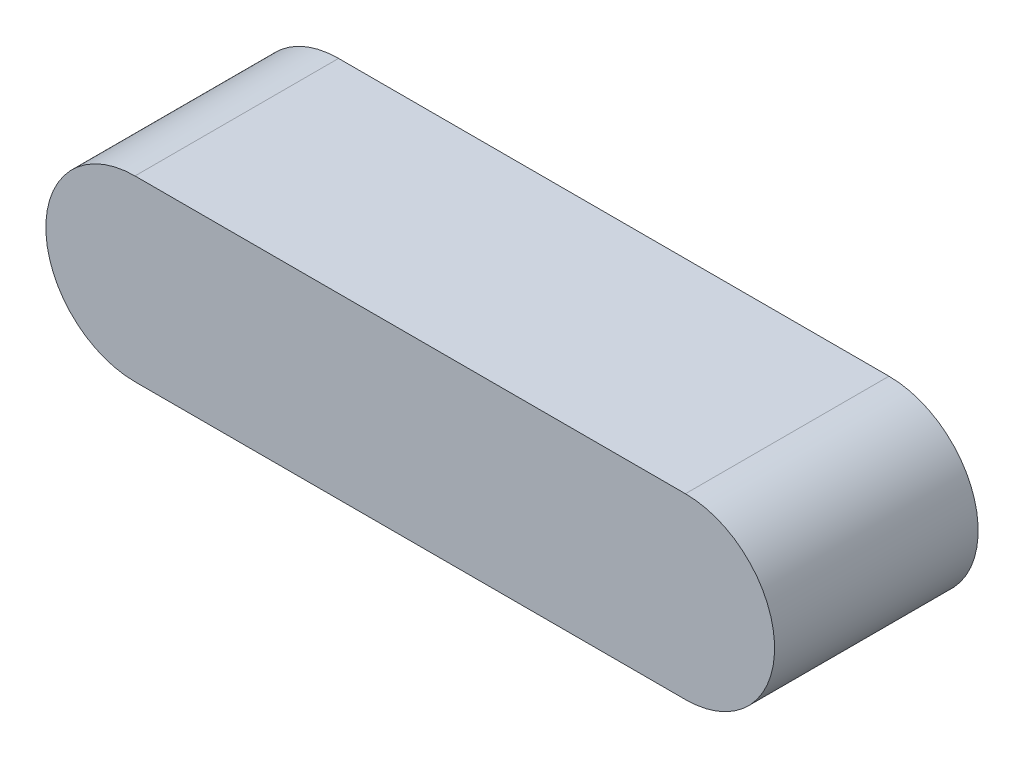
ISO-10303-21;
HEADER;
FILE_DESCRIPTION(('STEP AP214'),'2;1');
FILE_NAME('part.step','',(''),(''),'','','');
FILE_SCHEMA(('AUTOMOTIVE_DESIGN { 1 0 10303 214 1 1 1 1 }'));
ENDSEC;
DATA;
#1=APPLICATION_CONTEXT('core data for automotive mechanical design processes');
#2=APPLICATION_PROTOCOL_DEFINITION('international standard','automotive_design',2000,#1);
#3=PRODUCT_CONTEXT('',#1,'mechanical');
#4=PRODUCT('Part','Part','',(#3));
#5=PRODUCT_RELATED_PRODUCT_CATEGORY('part','',(#4));
#6=PRODUCT_DEFINITION_FORMATION('','',#4);
#7=PRODUCT_DEFINITION_CONTEXT('part definition',#1,'design');
#8=PRODUCT_DEFINITION('design','',#6,#7);
#9=PRODUCT_DEFINITION_SHAPE('','',#8);
#10=(LENGTH_UNIT() NAMED_UNIT(*) SI_UNIT(.MILLI.,.METRE.));
#11=(NAMED_UNIT(*) PLANE_ANGLE_UNIT() SI_UNIT($,.RADIAN.));
#12=(NAMED_UNIT(*) SI_UNIT($,.STERADIAN.) SOLID_ANGLE_UNIT());
#13=UNCERTAINTY_MEASURE_WITH_UNIT(LENGTH_MEASURE(1.E-05),#10,'distance_accuracy_value','');
#14=(GEOMETRIC_REPRESENTATION_CONTEXT(3) GLOBAL_UNCERTAINTY_ASSIGNED_CONTEXT((#13)) GLOBAL_UNIT_ASSIGNED_CONTEXT((#10,
#11,#12)) REPRESENTATION_CONTEXT('',''));
#15=CARTESIAN_POINT('',(0.,0.,0.));
#16=DIRECTION('',(0.,0.,1.));
#17=DIRECTION('',(1.,0.,0.));
#18=AXIS2_PLACEMENT_3D('',#15,#16,#17);
#19=CARTESIAN_POINT('',(-8.6665,-13.719,11.731));
#20=DIRECTION('',(0.,0.,-1.));
#21=DIRECTION('',(-1.,0.,0.));
#22=AXIS2_PLACEMENT_3D('',#19,#20,#21);
#23=CYLINDRICAL_SURFACE('',#22,5.137);
#24=CARTESIAN_POINT('',(-8.6665,-13.719,0.));
#25=DIRECTION('',(0.,0.,1.));
#26=DIRECTION('',(1.,0.,0.));
#27=AXIS2_PLACEMENT_3D('',#24,#25,#26);
#28=CIRCLE('',#27,5.137);
#29=CARTESIAN_POINT('',(-8.6665,-8.582,0.));
#30=VERTEX_POINT('',#29);
#31=CARTESIAN_POINT('',(-8.6665,-18.856,0.));
#32=VERTEX_POINT('',#31);
#33=EDGE_CURVE('E101',#30,#32,#28,.T.);
#34=ORIENTED_EDGE('',*,*,#33,.T.);
#35=DIRECTION('',(0.,0.,-1.));
#36=VECTOR('',#35,1.);
#37=CARTESIAN_POINT('',(-8.6665,-18.856,11.731));
#38=LINE('',#37,#36);
#39=CARTESIAN_POINT('',(-8.6665,-18.856,11.731));
#40=VERTEX_POINT('',#39);
#41=EDGE_CURVE('E11',#40,#32,#38,.T.);
#42=ORIENTED_EDGE('',*,*,#41,.F.);
#43=CARTESIAN_POINT('',(-8.6665,-13.719,11.731));
#44=DIRECTION('',(0.,0.,1.));
#45=DIRECTION('',(1.,0.,0.));
#46=AXIS2_PLACEMENT_3D('',#43,#44,#45);
#47=CIRCLE('',#46,5.137);
#48=CARTESIAN_POINT('',(-8.6665,-8.582,11.731));
#49=VERTEX_POINT('',#48);
#50=EDGE_CURVE('E95',#49,#40,#47,.T.);
#51=ORIENTED_EDGE('',*,*,#50,.F.);
#52=DIRECTION('',(0.,0.,-1.));
#53=VECTOR('',#52,1.);
#54=CARTESIAN_POINT('',(-8.6665,-8.582,11.731));
#55=LINE('',#54,#53);
#56=EDGE_CURVE('E99',#49,#30,#55,.T.);
#57=ORIENTED_EDGE('',*,*,#56,.T.);
#58=EDGE_LOOP('',(#34,#42,#51,#57));
#59=FACE_BOUND('',#58,.T.);
#60=ADVANCED_FACE('F41',(#59),#23,.T.);
#61=CARTESIAN_POINT('',(-8.6665,-18.856,11.731));
#62=DIRECTION('',(0.,1.,0.));
#63=DIRECTION('',(0.,0.,1.));
#64=AXIS2_PLACEMENT_3D('',#61,#62,#63);
#65=PLANE('',#64);
#66=DIRECTION('',(1.,0.,0.));
#67=VECTOR('',#66,1.);
#68=CARTESIAN_POINT('',(-8.6665,-18.856,0.));
#69=LINE('',#68,#67);
#70=CARTESIAN_POINT('',(23.0525,-18.856,0.));
#71=VERTEX_POINT('',#70);
#72=EDGE_CURVE('E96',#32,#71,#69,.T.);
#73=ORIENTED_EDGE('',*,*,#72,.T.);
#74=DIRECTION('',(0.,0.,-1.));
#75=VECTOR('',#74,1.);
#76=CARTESIAN_POINT('',(23.0525,-18.856,11.731));
#77=LINE('',#76,#75);
#78=CARTESIAN_POINT('',(23.0525,-18.856,11.731));
#79=VERTEX_POINT('',#78);
#80=EDGE_CURVE('E47',#79,#71,#77,.T.);
#81=ORIENTED_EDGE('',*,*,#80,.F.);
#82=DIRECTION('',(1.,0.,0.));
#83=VECTOR('',#82,1.);
#84=CARTESIAN_POINT('',(-8.6665,-18.856,11.731));
#85=LINE('',#84,#83);
#86=EDGE_CURVE('E90',#40,#79,#85,.T.);
#87=ORIENTED_EDGE('',*,*,#86,.F.);
#88=ORIENTED_EDGE('',*,*,#41,.T.);
#89=EDGE_LOOP('',(#73,#81,#87,#88));
#90=FACE_BOUND('',#89,.T.);
#91=ADVANCED_FACE('F94',(#90),#65,.F.);
#92=CARTESIAN_POINT('',(23.0525,-13.719,11.731));
#93=DIRECTION('',(0.,0.,-1.));
#94=DIRECTION('',(-1.,0.,0.));
#95=AXIS2_PLACEMENT_3D('',#92,#93,#94);
#96=CYLINDRICAL_SURFACE('',#95,5.137);
#97=CARTESIAN_POINT('',(23.0525,-13.719,0.));
#98=DIRECTION('',(0.,0.,1.));
#99=DIRECTION('',(1.,0.,0.));
#100=AXIS2_PLACEMENT_3D('',#97,#98,#99);
#101=CIRCLE('',#100,5.137);
#102=CARTESIAN_POINT('',(23.0525,-8.582,0.));
#103=VERTEX_POINT('',#102);
#104=EDGE_CURVE('E71',#71,#103,#101,.T.);
#105=ORIENTED_EDGE('',*,*,#104,.T.);
#106=DIRECTION('',(0.,0.,-1.));
#107=VECTOR('',#106,1.);
#108=CARTESIAN_POINT('',(23.0525,-8.582,11.731));
#109=LINE('',#108,#107);
#110=CARTESIAN_POINT('',(23.0525,-8.582,11.731));
#111=VERTEX_POINT('',#110);
#112=EDGE_CURVE('E100',#111,#103,#109,.T.);
#113=ORIENTED_EDGE('',*,*,#112,.F.);
#114=CARTESIAN_POINT('',(23.0525,-13.719,11.731));
#115=DIRECTION('',(0.,0.,1.));
#116=DIRECTION('',(1.,0.,0.));
#117=AXIS2_PLACEMENT_3D('',#114,#115,#116);
#118=CIRCLE('',#117,5.137);
#119=EDGE_CURVE('E89',#79,#111,#118,.T.);
#120=ORIENTED_EDGE('',*,*,#119,.F.);
#121=ORIENTED_EDGE('',*,*,#80,.T.);
#122=EDGE_LOOP('',(#105,#113,#120,#121));
#123=FACE_BOUND('',#122,.T.);
#124=ADVANCED_FACE('F97',(#123),#96,.T.);
#125=CARTESIAN_POINT('',(23.0525,-8.582,11.731));
#126=DIRECTION('',(0.,-1.,0.));
#127=DIRECTION('',(0.,0.,-1.));
#128=AXIS2_PLACEMENT_3D('',#125,#126,#127);
#129=PLANE('',#128);
#130=DIRECTION('',(-1.,0.,0.));
#131=VECTOR('',#130,1.);
#132=CARTESIAN_POINT('',(23.0525,-8.582,0.));
#133=LINE('',#132,#131);
#134=EDGE_CURVE('E79',#103,#30,#133,.T.);
#135=ORIENTED_EDGE('',*,*,#134,.T.);
#136=ORIENTED_EDGE('',*,*,#56,.F.);
#137=DIRECTION('',(-1.,0.,0.));
#138=VECTOR('',#137,1.);
#139=CARTESIAN_POINT('',(23.0525,-8.582,11.731));
#140=LINE('',#139,#138);
#141=EDGE_CURVE('E60',#111,#49,#140,.T.);
#142=ORIENTED_EDGE('',*,*,#141,.F.);
#143=ORIENTED_EDGE('',*,*,#112,.T.);
#144=EDGE_LOOP('',(#135,#136,#142,#143));
#145=FACE_BOUND('',#144,.T.);
#146=ADVANCED_FACE('F112',(#145),#129,.F.);
#147=CARTESIAN_POINT('',(-8.6665,-13.719,11.731));
#148=DIRECTION('',(0.,0.,1.));
#149=DIRECTION('',(1.,0.,0.));
#150=AXIS2_PLACEMENT_3D('',#147,#148,#149);
#151=PLANE('',#150);
#152=ORIENTED_EDGE('',*,*,#50,.T.);
#153=ORIENTED_EDGE('',*,*,#86,.T.);
#154=ORIENTED_EDGE('',*,*,#119,.T.);
#155=ORIENTED_EDGE('',*,*,#141,.T.);
#156=EDGE_LOOP('',(#152,#153,#154,#155));
#157=FACE_BOUND('',#156,.T.);
#158=ADVANCED_FACE('F88',(#157),#151,.T.);
#159=CARTESIAN_POINT('',(-8.6665,-13.719,0.));
#160=DIRECTION('',(0.,0.,1.));
#161=DIRECTION('',(1.,0.,0.));
#162=AXIS2_PLACEMENT_3D('',#159,#160,#161);
#163=PLANE('',#162);
#164=ORIENTED_EDGE('',*,*,#33,.F.);
#165=ORIENTED_EDGE('',*,*,#134,.F.);
#166=ORIENTED_EDGE('',*,*,#104,.F.);
#167=ORIENTED_EDGE('',*,*,#72,.F.);
#168=EDGE_LOOP('',(#164,#165,#166,#167));
#169=FACE_BOUND('',#168,.T.);
#170=ADVANCED_FACE('F114',(#169),#163,.F.);
#171=CLOSED_SHELL('',(#60,#91,#124,#146,#158,#170));
#172=MANIFOLD_SOLID_BREP('B2',#171);
#173=ADVANCED_BREP_SHAPE_REPRESENTATION('',(#18,#172),#14);
#174=SHAPE_DEFINITION_REPRESENTATION(#9,#173);
ENDSEC;
END-ISO-10303-21;
